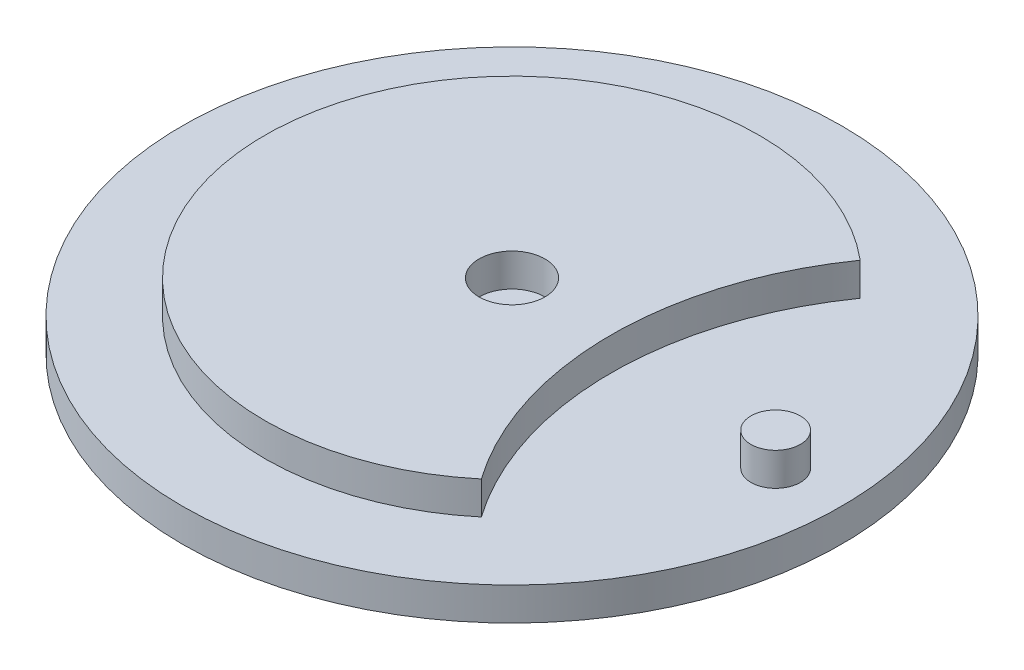
ISO-10303-21;
HEADER;
FILE_DESCRIPTION(('STEP AP214'),'2;1');
FILE_NAME('part.step','',(''),(''),'','','');
FILE_SCHEMA(('AUTOMOTIVE_DESIGN { 1 0 10303 214 1 1 1 1 }'));
ENDSEC;
DATA;
#1=APPLICATION_CONTEXT('core data for automotive mechanical design processes');
#2=APPLICATION_PROTOCOL_DEFINITION('international standard','automotive_design',2000,#1);
#3=PRODUCT_CONTEXT('',#1,'mechanical');
#4=PRODUCT('Part','Part','',(#3));
#5=PRODUCT_RELATED_PRODUCT_CATEGORY('part','',(#4));
#6=PRODUCT_DEFINITION_FORMATION('','',#4);
#7=PRODUCT_DEFINITION_CONTEXT('part definition',#1,'design');
#8=PRODUCT_DEFINITION('design','',#6,#7);
#9=PRODUCT_DEFINITION_SHAPE('','',#8);
#10=(LENGTH_UNIT() NAMED_UNIT(*) SI_UNIT(.MILLI.,.METRE.));
#11=(NAMED_UNIT(*) PLANE_ANGLE_UNIT() SI_UNIT($,.RADIAN.));
#12=(NAMED_UNIT(*) SI_UNIT($,.STERADIAN.) SOLID_ANGLE_UNIT());
#13=UNCERTAINTY_MEASURE_WITH_UNIT(LENGTH_MEASURE(1.E-05),#10,'distance_accuracy_value','');
#14=(GEOMETRIC_REPRESENTATION_CONTEXT(3) GLOBAL_UNCERTAINTY_ASSIGNED_CONTEXT((#13)) GLOBAL_UNIT_ASSIGNED_CONTEXT((#10,
#11,#12)) REPRESENTATION_CONTEXT('',''));
#15=CARTESIAN_POINT('',(0.,0.,0.));
#16=DIRECTION('',(0.,0.,1.));
#17=DIRECTION('',(1.,0.,0.));
#18=AXIS2_PLACEMENT_3D('',#15,#16,#17);
#19=CARTESIAN_POINT('',(65.,10.,0.));
#20=DIRECTION('',(0.,1.,0.));
#21=DIRECTION('',(0.,0.,1.));
#22=AXIS2_PLACEMENT_3D('',#19,#20,#21);
#23=PLANE('',#22);
#24=CARTESIAN_POINT('',(130.,10.,0.));
#25=DIRECTION('',(0.,-1.,0.));
#26=DIRECTION('',(0.,0.,1.));
#27=AXIS2_PLACEMENT_3D('',#24,#25,#26);
#28=CIRCLE('',#27,100.);
#29=CARTESIAN_POINT('',(48.1730769230769,10.,57.4835164178681));
#30=VERTEX_POINT('',#29);
#31=CARTESIAN_POINT('',(48.1730769230769,10.,-57.4835164178681));
#32=VERTEX_POINT('',#31);
#33=EDGE_CURVE('E81',#30,#32,#28,.T.);
#34=ORIENTED_EDGE('',*,*,#33,.T.);
#35=CARTESIAN_POINT('',(0.,10.,0.));
#36=DIRECTION('',(0.,1.,0.));
#37=DIRECTION('',(0.,0.,1.));
#38=AXIS2_PLACEMENT_3D('',#35,#36,#37);
#39=CIRCLE('',#38,75.);
#40=EDGE_CURVE('E55',#32,#30,#39,.T.);
#41=ORIENTED_EDGE('',*,*,#40,.T.);
#42=EDGE_LOOP('',(#34,#41));
#43=FACE_BOUND('',#42,.T.);
#44=CARTESIAN_POINT('',(0.,10.,0.));
#45=DIRECTION('',(0.,1.,0.));
#46=DIRECTION('',(0.,0.,1.));
#47=AXIS2_PLACEMENT_3D('',#44,#45,#46);
#48=CIRCLE('',#47,10.);
#49=CARTESIAN_POINT('',(0.,10.,10.));
#50=VERTEX_POINT('',#49);
#51=EDGE_CURVE('E74',#50,#50,#48,.T.);
#52=ORIENTED_EDGE('',*,*,#51,.F.);
#53=EDGE_LOOP('',(#52));
#54=FACE_BOUND('',#53,.T.);
#55=ADVANCED_FACE('F39',(#43,#54),#23,.T.);
#56=CARTESIAN_POINT('',(130.,10.,0.));
#57=DIRECTION('',(0.,-1.,0.));
#58=DIRECTION('',(0.,0.,-1.));
#59=AXIS2_PLACEMENT_3D('',#56,#57,#58);
#60=CYLINDRICAL_SURFACE('',#59,100.);
#61=CARTESIAN_POINT('',(130.,0.,0.));
#62=DIRECTION('',(0.,-1.,0.));
#63=DIRECTION('',(0.,0.,1.));
#64=AXIS2_PLACEMENT_3D('',#61,#62,#63);
#65=CIRCLE('',#64,100.);
#66=CARTESIAN_POINT('',(48.1730769230769,0.,57.4835164178681));
#67=VERTEX_POINT('',#66);
#68=CARTESIAN_POINT('',(48.1730769230769,0.,-57.4835164178681));
#69=VERTEX_POINT('',#68);
#70=EDGE_CURVE('E67',#67,#69,#65,.T.);
#71=ORIENTED_EDGE('',*,*,#70,.T.);
#72=DIRECTION('',(0.,-1.,0.));
#73=VECTOR('',#72,1.);
#74=CARTESIAN_POINT('',(48.1730769230769,10.,-57.4835164178681));
#75=LINE('',#74,#73);
#76=EDGE_CURVE('E49',#32,#69,#75,.T.);
#77=ORIENTED_EDGE('',*,*,#76,.F.);
#78=ORIENTED_EDGE('',*,*,#33,.F.);
#79=DIRECTION('',(0.,-1.,0.));
#80=VECTOR('',#79,1.);
#81=CARTESIAN_POINT('',(48.1730769230769,10.,57.4835164178681));
#82=LINE('',#81,#80);
#83=EDGE_CURVE('E78',#30,#67,#82,.T.);
#84=ORIENTED_EDGE('',*,*,#83,.T.);
#85=EDGE_LOOP('',(#71,#77,#78,#84));
#86=FACE_BOUND('',#85,.T.);
#87=ADVANCED_FACE('F41',(#86),#60,.F.);
#88=CARTESIAN_POINT('',(0.,10.,0.));
#89=DIRECTION('',(0.,-1.,0.));
#90=DIRECTION('',(0.,0.,-1.));
#91=AXIS2_PLACEMENT_3D('',#88,#89,#90);
#92=CYLINDRICAL_SURFACE('',#91,75.);
#93=CARTESIAN_POINT('',(0.,0.,0.));
#94=DIRECTION('',(0.,1.,0.));
#95=DIRECTION('',(0.,0.,1.));
#96=AXIS2_PLACEMENT_3D('',#93,#94,#95);
#97=CIRCLE('',#96,75.);
#98=EDGE_CURVE('E64',#69,#67,#97,.T.);
#99=ORIENTED_EDGE('',*,*,#98,.T.);
#100=ORIENTED_EDGE('',*,*,#83,.F.);
#101=ORIENTED_EDGE('',*,*,#40,.F.);
#102=ORIENTED_EDGE('',*,*,#76,.T.);
#103=EDGE_LOOP('',(#99,#100,#101,#102));
#104=FACE_BOUND('',#103,.T.);
#105=ADVANCED_FACE('F77',(#104),#92,.T.);
#106=CARTESIAN_POINT('',(0.,10.,0.));
#107=DIRECTION('',(0.,-1.,0.));
#108=DIRECTION('',(0.,0.,-1.));
#109=AXIS2_PLACEMENT_3D('',#106,#107,#108);
#110=CYLINDRICAL_SURFACE('',#109,10.);
#111=ORIENTED_EDGE('',*,*,#51,.T.);
#112=EDGE_LOOP('',(#111));
#113=FACE_BOUND('',#112,.T.);
#114=CARTESIAN_POINT('',(0.,0.,0.));
#115=DIRECTION('',(0.,1.,0.));
#116=DIRECTION('',(0.,0.,1.));
#117=AXIS2_PLACEMENT_3D('',#114,#115,#116);
#118=CIRCLE('',#117,10.);
#119=CARTESIAN_POINT('',(0.,0.,10.));
#120=VERTEX_POINT('',#119);
#121=EDGE_CURVE('E91',#120,#120,#118,.T.);
#122=ORIENTED_EDGE('',*,*,#121,.F.);
#123=EDGE_LOOP('',(#122));
#124=FACE_BOUND('',#123,.T.);
#125=ADVANCED_FACE('F131',(#113,#124),#110,.F.);
#126=CARTESIAN_POINT('',(0.,0.,0.));
#127=DIRECTION('',(0.,-1.,0.));
#128=DIRECTION('',(0.,0.,-1.));
#129=AXIS2_PLACEMENT_3D('',#126,#127,#128);
#130=PLANE('',#129);
#131=ORIENTED_EDGE('',*,*,#121,.T.);
#132=EDGE_LOOP('',(#131));
#133=FACE_BOUND('',#132,.T.);
#134=ADVANCED_FACE('F122',(#133),#130,.F.);
#135=CARTESIAN_POINT('',(0.,-10.,0.));
#136=DIRECTION('',(0.,1.,0.));
#137=DIRECTION('',(0.,0.,1.));
#138=AXIS2_PLACEMENT_3D('',#135,#136,#137);
#139=CYLINDRICAL_SURFACE('',#138,100.);
#140=CARTESIAN_POINT('',(0.,-10.,0.));
#141=DIRECTION('',(0.,-1.,0.));
#142=DIRECTION('',(0.,0.,-1.));
#143=AXIS2_PLACEMENT_3D('',#140,#141,#142);
#144=CIRCLE('',#143,100.);
#145=CARTESIAN_POINT('',(0.,-10.,-100.));
#146=VERTEX_POINT('',#145);
#147=EDGE_CURVE('E95',#146,#146,#144,.T.);
#148=ORIENTED_EDGE('',*,*,#147,.F.);
#149=EDGE_LOOP('',(#148));
#150=FACE_BOUND('',#149,.T.);
#151=CARTESIAN_POINT('',(0.,0.,0.));
#152=DIRECTION('',(0.,-1.,0.));
#153=DIRECTION('',(0.,0.,-1.));
#154=AXIS2_PLACEMENT_3D('',#151,#152,#153);
#155=CIRCLE('',#154,100.);
#156=CARTESIAN_POINT('',(0.,0.,-100.));
#157=VERTEX_POINT('',#156);
#158=EDGE_CURVE('E99',#157,#157,#155,.T.);
#159=ORIENTED_EDGE('',*,*,#158,.T.);
#160=EDGE_LOOP('',(#159));
#161=FACE_BOUND('',#160,.T.);
#162=ADVANCED_FACE('F126',(#150,#161),#139,.T.);
#163=CARTESIAN_POINT('',(0.,-10.,0.));
#164=DIRECTION('',(0.,-1.,0.));
#165=DIRECTION('',(0.,0.,-1.));
#166=AXIS2_PLACEMENT_3D('',#163,#164,#165);
#167=PLANE('',#166);
#168=ORIENTED_EDGE('',*,*,#147,.T.);
#169=EDGE_LOOP('',(#168));
#170=FACE_BOUND('',#169,.T.);
#171=ADVANCED_FACE('F120',(#170),#167,.T.);
#172=CARTESIAN_POINT('',(80.,0.,0.));
#173=DIRECTION('',(0.,-1.,0.));
#174=DIRECTION('',(0.,0.,-1.));
#175=AXIS2_PLACEMENT_3D('',#172,#173,#174);
#176=CIRCLE('',#175,7.50000000000001);
#177=CARTESIAN_POINT('',(80.,0.,-7.50000000000001));
#178=VERTEX_POINT('',#177);
#179=EDGE_CURVE('E11',#178,#178,#176,.F.);
#180=ORIENTED_EDGE('',*,*,#179,.F.);
#181=EDGE_LOOP('',(#180));
#182=FACE_BOUND('',#181,.T.);
#183=ORIENTED_EDGE('',*,*,#70,.F.);
#184=ORIENTED_EDGE('',*,*,#98,.F.);
#185=EDGE_LOOP('',(#183,#184));
#186=FACE_BOUND('',#185,.T.);
#187=ORIENTED_EDGE('',*,*,#158,.F.);
#188=EDGE_LOOP('',(#187));
#189=FACE_BOUND('',#188,.T.);
#190=ADVANCED_FACE('F68',(#182,#186,#189),#130,.F.);
#191=CARTESIAN_POINT('',(80.,10.,0.));
#192=DIRECTION('',(0.,-1.,0.));
#193=DIRECTION('',(0.,0.,-1.));
#194=AXIS2_PLACEMENT_3D('',#191,#192,#193);
#195=CYLINDRICAL_SURFACE('',#194,7.50000000000001);
#196=CARTESIAN_POINT('',(80.,10.,0.));
#197=DIRECTION('',(0.,1.,0.));
#198=DIRECTION('',(0.,0.,1.));
#199=AXIS2_PLACEMENT_3D('',#196,#197,#198);
#200=CIRCLE('',#199,7.50000000000001);
#201=CARTESIAN_POINT('',(80.,10.,7.50000000000001));
#202=VERTEX_POINT('',#201);
#203=EDGE_CURVE('E103',#202,#202,#200,.T.);
#204=ORIENTED_EDGE('',*,*,#203,.F.);
#205=EDGE_LOOP('',(#204));
#206=FACE_BOUND('',#205,.T.);
#207=ORIENTED_EDGE('',*,*,#179,.T.);
#208=EDGE_LOOP('',(#207));
#209=FACE_BOUND('',#208,.T.);
#210=ADVANCED_FACE('F113',(#206,#209),#195,.T.);
#211=CARTESIAN_POINT('',(80.,10.,0.));
#212=DIRECTION('',(0.,1.,0.));
#213=DIRECTION('',(0.,0.,1.));
#214=AXIS2_PLACEMENT_3D('',#211,#212,#213);
#215=PLANE('',#214);
#216=ORIENTED_EDGE('',*,*,#203,.T.);
#217=EDGE_LOOP('',(#216));
#218=FACE_BOUND('',#217,.T.);
#219=ADVANCED_FACE('F111',(#218),#215,.T.);
#220=CLOSED_SHELL('',(#55,#87,#105,#125,#134,#162,#171,#190,#210,#219));
#221=MANIFOLD_SOLID_BREP('B2',#220);
#222=ADVANCED_BREP_SHAPE_REPRESENTATION('',(#18,#221),#14);
#223=SHAPE_DEFINITION_REPRESENTATION(#9,#222);
ENDSEC;
END-ISO-10303-21;
